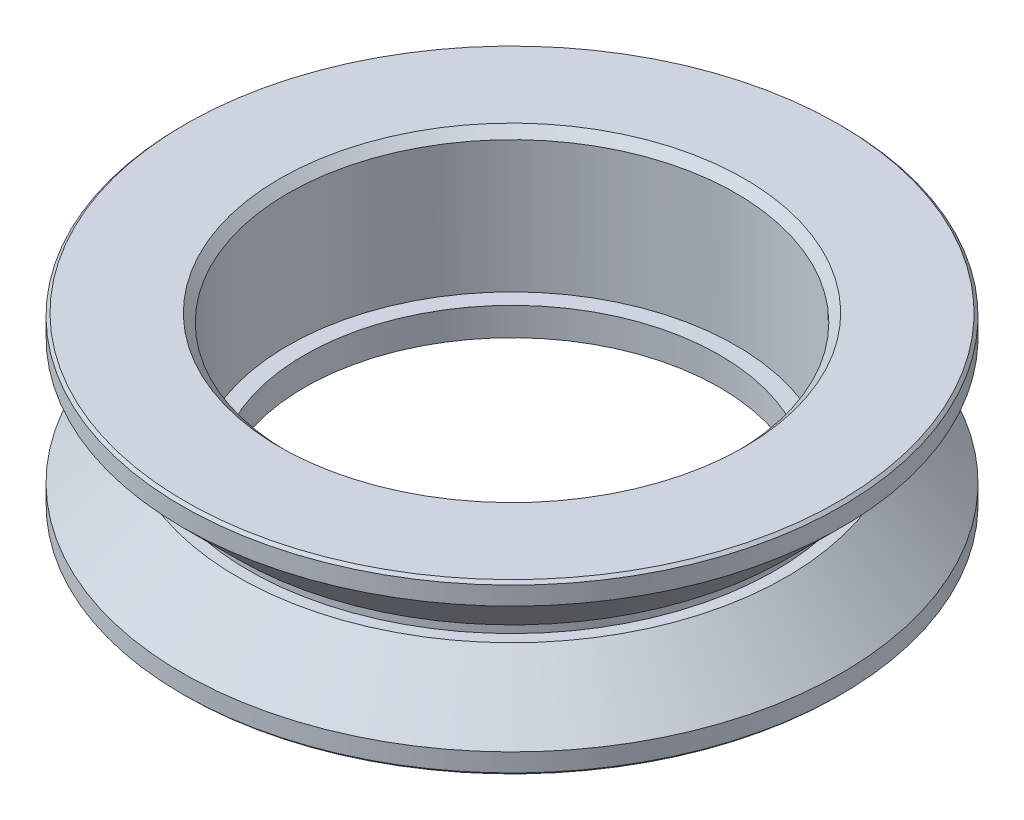
ISO-10303-21;
HEADER;
FILE_DESCRIPTION(('STEP AP214'),'2;1');
FILE_NAME('part.step','',(''),(''),'','','');
FILE_SCHEMA(('AUTOMOTIVE_DESIGN { 1 0 10303 214 1 1 1 1 }'));
ENDSEC;
DATA;
#1=APPLICATION_CONTEXT('core data for automotive mechanical design processes');
#2=APPLICATION_PROTOCOL_DEFINITION('international standard','automotive_design',2000,#1);
#3=PRODUCT_CONTEXT('',#1,'mechanical');
#4=PRODUCT('Part','Part','',(#3));
#5=PRODUCT_RELATED_PRODUCT_CATEGORY('part','',(#4));
#6=PRODUCT_DEFINITION_FORMATION('','',#4);
#7=PRODUCT_DEFINITION_CONTEXT('part definition',#1,'design');
#8=PRODUCT_DEFINITION('design','',#6,#7);
#9=PRODUCT_DEFINITION_SHAPE('','',#8);
#10=(LENGTH_UNIT() NAMED_UNIT(*) SI_UNIT(.MILLI.,.METRE.));
#11=(NAMED_UNIT(*) PLANE_ANGLE_UNIT() SI_UNIT($,.RADIAN.));
#12=(NAMED_UNIT(*) SI_UNIT($,.STERADIAN.) SOLID_ANGLE_UNIT());
#13=UNCERTAINTY_MEASURE_WITH_UNIT(LENGTH_MEASURE(1.E-05),#10,'distance_accuracy_value','');
#14=(GEOMETRIC_REPRESENTATION_CONTEXT(3) GLOBAL_UNCERTAINTY_ASSIGNED_CONTEXT((#13)) GLOBAL_UNIT_ASSIGNED_CONTEXT((#10,
#11,#12)) REPRESENTATION_CONTEXT('',''));
#15=CARTESIAN_POINT('',(0.,0.,0.));
#16=DIRECTION('',(0.,0.,1.));
#17=DIRECTION('',(1.,0.,0.));
#18=AXIS2_PLACEMENT_3D('',#15,#16,#17);
#19=CARTESIAN_POINT('',(0.,2.25000000000015,0.));
#20=DIRECTION('',(0.,1.,0.));
#21=DIRECTION('',(0.,0.,1.));
#22=AXIS2_PLACEMENT_3D('',#19,#20,#21);
#23=CONICAL_SURFACE('',#22,11.7499999999999,0.7853981633973);
#24=CARTESIAN_POINT('',(0.,2.25,0.));
#25=DIRECTION('',(0.,-1.,0.));
#26=DIRECTION('',(0.,0.,-1.));
#27=AXIS2_PLACEMENT_3D('',#24,#25,#26);
#28=CIRCLE('',#27,11.75);
#29=CARTESIAN_POINT('',(0.,2.25,-11.75));
#30=VERTEX_POINT('',#29);
#31=EDGE_CURVE('E30',#30,#30,#28,.F.);
#32=ORIENTED_EDGE('',*,*,#31,.F.);
#33=EDGE_LOOP('',(#32));
#34=FACE_BOUND('',#33,.T.);
#35=CARTESIAN_POINT('',(0.,0.274999999999853,0.));
#36=DIRECTION('',(0.,1.,0.));
#37=DIRECTION('',(0.,0.,1.));
#38=AXIS2_PLACEMENT_3D('',#35,#36,#37);
#39=CIRCLE('',#38,9.77500000000015);
#40=CARTESIAN_POINT('',(0.,0.274999999999853,9.77500000000015));
#41=VERTEX_POINT('',#40);
#42=EDGE_CURVE('E18',#41,#41,#39,.F.);
#43=ORIENTED_EDGE('',*,*,#42,.F.);
#44=EDGE_LOOP('',(#43));
#45=FACE_BOUND('',#44,.T.);
#46=ADVANCED_FACE('F15',(#34,#45),#23,.T.);
#47=CARTESIAN_POINT('',(0.,3.3,0.));
#48=DIRECTION('',(0.,-1.,0.));
#49=DIRECTION('',(0.,0.,-1.));
#50=AXIS2_PLACEMENT_3D('',#47,#48,#49);
#51=CYLINDRICAL_SURFACE('',#50,11.75);
#52=ORIENTED_EDGE('',*,*,#31,.T.);
#53=EDGE_LOOP('',(#52));
#54=FACE_BOUND('',#53,.T.);
#55=CARTESIAN_POINT('',(0.,2.90000000000099,0.));
#56=DIRECTION('',(0.,-1.,0.));
#57=DIRECTION('',(0.,0.,-1.));
#58=AXIS2_PLACEMENT_3D('',#55,#56,#57);
#59=CIRCLE('',#58,11.750000000001);
#60=CARTESIAN_POINT('',(0.,2.90000000000099,-11.750000000001));
#61=VERTEX_POINT('',#60);
#62=EDGE_CURVE('E54',#61,#61,#59,.F.);
#63=ORIENTED_EDGE('',*,*,#62,.F.);
#64=EDGE_LOOP('',(#63));
#65=FACE_BOUND('',#64,.T.);
#66=ADVANCED_FACE('F199',(#54,#65),#51,.T.);
#67=CARTESIAN_POINT('',(0.,0.275,0.));
#68=DIRECTION('',(0.,-1.,0.));
#69=DIRECTION('',(0.,0.,-1.));
#70=AXIS2_PLACEMENT_3D('',#67,#68,#69);
#71=PLANE('',#70);
#72=CARTESIAN_POINT('',(0.,0.275,0.));
#73=DIRECTION('',(0.,-1.,0.));
#74=DIRECTION('',(0.,0.,-1.));
#75=AXIS2_PLACEMENT_3D('',#72,#73,#74);
#76=CIRCLE('',#75,9.375);
#77=CARTESIAN_POINT('',(0.,0.275,-9.375));
#78=VERTEX_POINT('',#77);
#79=EDGE_CURVE('E52',#78,#78,#76,.T.);
#80=ORIENTED_EDGE('',*,*,#79,.F.);
#81=EDGE_LOOP('',(#80));
#82=FACE_BOUND('',#81,.T.);
#83=ORIENTED_EDGE('',*,*,#42,.T.);
#84=EDGE_LOOP('',(#83));
#85=FACE_BOUND('',#84,.T.);
#86=ADVANCED_FACE('F191',(#82,#85),#71,.T.);
#87=CARTESIAN_POINT('',(0.,2.90000000000099,0.));
#88=DIRECTION('',(0.,-1.,0.));
#89=DIRECTION('',(0.,0.,-1.));
#90=AXIS2_PLACEMENT_3D('',#87,#88,#89);
#91=CONICAL_SURFACE('',#90,11.750000000001,0.785398163397297);
#92=ORIENTED_EDGE('',*,*,#62,.T.);
#93=EDGE_LOOP('',(#92));
#94=FACE_BOUND('',#93,.T.);
#95=CARTESIAN_POINT('',(0.,3.00000000000101,0.));
#96=DIRECTION('',(0.,-1.,0.));
#97=DIRECTION('',(0.,0.,-1.));
#98=AXIS2_PLACEMENT_3D('',#95,#96,#97);
#99=CIRCLE('',#98,11.650000000001);
#100=CARTESIAN_POINT('',(0.,3.00000000000101,-11.650000000001));
#101=VERTEX_POINT('',#100);
#102=EDGE_CURVE('E50',#101,#101,#99,.F.);
#103=ORIENTED_EDGE('',*,*,#102,.F.);
#104=EDGE_LOOP('',(#103));
#105=FACE_BOUND('',#104,.T.);
#106=ADVANCED_FACE('F182',(#94,#105),#91,.T.);
#107=CARTESIAN_POINT('',(0.,0.3025,0.));
#108=DIRECTION('',(0.,-1.,0.));
#109=DIRECTION('',(0.,0.,-1.));
#110=AXIS2_PLACEMENT_3D('',#107,#108,#109);
#111=CYLINDRICAL_SURFACE('',#110,9.375);
#112=CARTESIAN_POINT('',(0.,-0.275,0.));
#113=DIRECTION('',(0.,-1.,0.));
#114=DIRECTION('',(0.,0.,-1.));
#115=AXIS2_PLACEMENT_3D('',#112,#113,#114);
#116=CIRCLE('',#115,9.375);
#117=CARTESIAN_POINT('',(0.,-0.275,-9.375));
#118=VERTEX_POINT('',#117);
#119=EDGE_CURVE('E47',#118,#118,#116,.F.);
#120=ORIENTED_EDGE('',*,*,#119,.T.);
#121=EDGE_LOOP('',(#120));
#122=FACE_BOUND('',#121,.T.);
#123=ORIENTED_EDGE('',*,*,#79,.T.);
#124=EDGE_LOOP('',(#123));
#125=FACE_BOUND('',#124,.T.);
#126=ADVANCED_FACE('F173',(#122,#125),#111,.T.);
#127=CARTESIAN_POINT('',(0.,3.,0.));
#128=DIRECTION('',(0.,1.,0.));
#129=DIRECTION('',(0.,0.,1.));
#130=AXIS2_PLACEMENT_3D('',#127,#128,#129);
#131=PLANE('',#130);
#132=CARTESIAN_POINT('',(0.,3.00000000000002,0.));
#133=DIRECTION('',(0.,1.,0.));
#134=DIRECTION('',(-1.,0.,0.));
#135=AXIS2_PLACEMENT_3D('',#132,#133,#134);
#136=CIRCLE('',#135,8.28714999999998);
#137=CARTESIAN_POINT('',(-8.28714999999998,3.00000000000002,0.));
#138=VERTEX_POINT('',#137);
#139=EDGE_CURVE('E44',#138,#138,#136,.F.);
#140=ORIENTED_EDGE('',*,*,#139,.T.);
#141=EDGE_LOOP('',(#140));
#142=FACE_BOUND('',#141,.T.);
#143=ORIENTED_EDGE('',*,*,#102,.T.);
#144=EDGE_LOOP('',(#143));
#145=FACE_BOUND('',#144,.T.);
#146=ADVANCED_FACE('F164',(#142,#145),#131,.T.);
#147=CARTESIAN_POINT('',(0.,-0.275,0.));
#148=DIRECTION('',(0.,-1.,0.));
#149=DIRECTION('',(0.,0.,-1.));
#150=AXIS2_PLACEMENT_3D('',#147,#148,#149);
#151=PLANE('',#150);
#152=ORIENTED_EDGE('',*,*,#119,.F.);
#153=EDGE_LOOP('',(#152));
#154=FACE_BOUND('',#153,.T.);
#155=CARTESIAN_POINT('',(0.,-0.274999999999853,0.));
#156=DIRECTION('',(0.,-1.,0.));
#157=DIRECTION('',(0.,0.,-1.));
#158=AXIS2_PLACEMENT_3D('',#155,#156,#157);
#159=CIRCLE('',#158,9.77500000000015);
#160=CARTESIAN_POINT('',(0.,-0.274999999999853,-9.77500000000015));
#161=VERTEX_POINT('',#160);
#162=EDGE_CURVE('E40',#161,#161,#159,.T.);
#163=ORIENTED_EDGE('',*,*,#162,.F.);
#164=EDGE_LOOP('',(#163));
#165=FACE_BOUND('',#164,.T.);
#166=ADVANCED_FACE('F155',(#154,#165),#151,.F.);
#167=CARTESIAN_POINT('',(0.,3.00000000000002,0.));
#168=DIRECTION('',(0.,1.,0.));
#169=DIRECTION('',(-1.,0.,0.));
#170=AXIS2_PLACEMENT_3D('',#167,#168,#169);
#171=CONICAL_SURFACE('',#170,8.28714999999998,0.785398163397301);
#172=CARTESIAN_POINT('',(0.,2.7,0.));
#173=DIRECTION('',(0.,1.,0.));
#174=DIRECTION('',(0.,0.,1.));
#175=AXIS2_PLACEMENT_3D('',#172,#173,#174);
#176=CIRCLE('',#175,7.98715);
#177=CARTESIAN_POINT('',(0.,2.7,7.98715));
#178=VERTEX_POINT('',#177);
#179=EDGE_CURVE('E43',#178,#178,#176,.F.);
#180=ORIENTED_EDGE('',*,*,#179,.T.);
#181=EDGE_LOOP('',(#180));
#182=FACE_BOUND('',#181,.T.);
#183=ORIENTED_EDGE('',*,*,#139,.F.);
#184=EDGE_LOOP('',(#183));
#185=FACE_BOUND('',#184,.T.);
#186=ADVANCED_FACE('F146',(#182,#185),#171,.F.);
#187=CARTESIAN_POINT('',(0.,-2.25000000000015,0.));
#188=DIRECTION('',(0.,-1.,0.));
#189=DIRECTION('',(0.,0.,-1.));
#190=AXIS2_PLACEMENT_3D('',#187,#188,#189);
#191=CONICAL_SURFACE('',#190,11.7499999999999,0.7853981633973);
#192=CARTESIAN_POINT('',(0.,-2.25,0.));
#193=DIRECTION('',(0.,-1.,0.));
#194=DIRECTION('',(0.,0.,-1.));
#195=AXIS2_PLACEMENT_3D('',#192,#193,#194);
#196=CIRCLE('',#195,11.75);
#197=CARTESIAN_POINT('',(0.,-2.25,-11.75));
#198=VERTEX_POINT('',#197);
#199=EDGE_CURVE('E39',#198,#198,#196,.T.);
#200=ORIENTED_EDGE('',*,*,#199,.F.);
#201=EDGE_LOOP('',(#200));
#202=FACE_BOUND('',#201,.T.);
#203=ORIENTED_EDGE('',*,*,#162,.T.);
#204=EDGE_LOOP('',(#203));
#205=FACE_BOUND('',#204,.T.);
#206=ADVANCED_FACE('F84',(#202,#205),#191,.T.);
#207=CARTESIAN_POINT('',(0.,-3.,0.));
#208=DIRECTION('',(0.,1.,0.));
#209=DIRECTION('',(0.,0.,1.));
#210=AXIS2_PLACEMENT_3D('',#207,#208,#209);
#211=CYLINDRICAL_SURFACE('',#210,7.98715);
#212=CARTESIAN_POINT('',(0.,-2.,0.));
#213=DIRECTION('',(0.,1.,0.));
#214=DIRECTION('',(0.,0.,1.));
#215=AXIS2_PLACEMENT_3D('',#212,#213,#214);
#216=CIRCLE('',#215,7.98715);
#217=CARTESIAN_POINT('',(0.,-2.,7.98715));
#218=VERTEX_POINT('',#217);
#219=EDGE_CURVE('E36',#218,#218,#216,.F.);
#220=ORIENTED_EDGE('',*,*,#219,.T.);
#221=EDGE_LOOP('',(#220));
#222=FACE_BOUND('',#221,.T.);
#223=ORIENTED_EDGE('',*,*,#179,.F.);
#224=EDGE_LOOP('',(#223));
#225=FACE_BOUND('',#224,.T.);
#226=ADVANCED_FACE('F74',(#222,#225),#211,.F.);
#227=CARTESIAN_POINT('',(0.,3.3,0.));
#228=DIRECTION('',(0.,-1.,0.));
#229=DIRECTION('',(0.,0.,-1.));
#230=AXIS2_PLACEMENT_3D('',#227,#228,#229);
#231=CYLINDRICAL_SURFACE('',#230,11.75);
#232=ORIENTED_EDGE('',*,*,#199,.T.);
#233=EDGE_LOOP('',(#232));
#234=FACE_BOUND('',#233,.T.);
#235=CARTESIAN_POINT('',(0.,-2.90000000000199,0.));
#236=DIRECTION('',(0.,1.,0.));
#237=DIRECTION('',(0.,0.,-1.));
#238=AXIS2_PLACEMENT_3D('',#235,#236,#237);
#239=CIRCLE('',#238,11.750000000002);
#240=CARTESIAN_POINT('',(0.,-2.90000000000199,-11.750000000002));
#241=VERTEX_POINT('',#240);
#242=EDGE_CURVE('E35',#241,#241,#239,.F.);
#243=ORIENTED_EDGE('',*,*,#242,.F.);
#244=EDGE_LOOP('',(#243));
#245=FACE_BOUND('',#244,.T.);
#246=ADVANCED_FACE('F71',(#234,#245),#231,.T.);
#247=CARTESIAN_POINT('',(0.,-2.,0.));
#248=DIRECTION('',(0.,-1.,0.));
#249=DIRECTION('',(0.,0.,-1.));
#250=AXIS2_PLACEMENT_3D('',#247,#248,#249);
#251=PLANE('',#250);
#252=CARTESIAN_POINT('',(0.,-2.,0.));
#253=DIRECTION('',(0.,-1.,0.));
#254=DIRECTION('',(0.,0.,-1.));
#255=AXIS2_PLACEMENT_3D('',#252,#253,#254);
#256=CIRCLE('',#255,7.4);
#257=CARTESIAN_POINT('',(0.,-2.,-7.4));
#258=VERTEX_POINT('',#257);
#259=EDGE_CURVE('E27',#258,#258,#256,.T.);
#260=ORIENTED_EDGE('',*,*,#259,.T.);
#261=EDGE_LOOP('',(#260));
#262=FACE_BOUND('',#261,.T.);
#263=ORIENTED_EDGE('',*,*,#219,.F.);
#264=EDGE_LOOP('',(#263));
#265=FACE_BOUND('',#264,.T.);
#266=ADVANCED_FACE('F73',(#262,#265),#251,.F.);
#267=CARTESIAN_POINT('',(0.,-2.90000000000199,0.));
#268=DIRECTION('',(0.,1.,0.));
#269=DIRECTION('',(0.,0.,1.));
#270=AXIS2_PLACEMENT_3D('',#267,#268,#269);
#271=CONICAL_SURFACE('',#270,11.750000000002,0.785398163397299);
#272=CARTESIAN_POINT('',(0.,-3.00000000000201,0.));
#273=DIRECTION('',(0.,1.,0.));
#274=DIRECTION('',(0.,0.,1.));
#275=AXIS2_PLACEMENT_3D('',#272,#273,#274);
#276=CIRCLE('',#275,11.650000000002);
#277=CARTESIAN_POINT('',(0.,-3.00000000000201,11.650000000002));
#278=VERTEX_POINT('',#277);
#279=EDGE_CURVE('E22',#278,#278,#276,.T.);
#280=ORIENTED_EDGE('',*,*,#279,.T.);
#281=EDGE_LOOP('',(#280));
#282=FACE_BOUND('',#281,.T.);
#283=ORIENTED_EDGE('',*,*,#242,.T.);
#284=EDGE_LOOP('',(#283));
#285=FACE_BOUND('',#284,.T.);
#286=ADVANCED_FACE('F69',(#282,#285),#271,.T.);
#287=CARTESIAN_POINT('',(0.,-3.,0.));
#288=DIRECTION('',(0.,-1.,0.));
#289=DIRECTION('',(0.,0.,-1.));
#290=AXIS2_PLACEMENT_3D('',#287,#288,#289);
#291=CYLINDRICAL_SURFACE('',#290,7.4);
#292=ORIENTED_EDGE('',*,*,#259,.F.);
#293=EDGE_LOOP('',(#292));
#294=FACE_BOUND('',#293,.T.);
#295=CARTESIAN_POINT('',(0.,-3.,0.));
#296=DIRECTION('',(0.,-1.,0.));
#297=DIRECTION('',(0.,0.,-1.));
#298=AXIS2_PLACEMENT_3D('',#295,#296,#297);
#299=CIRCLE('',#298,7.4);
#300=CARTESIAN_POINT('',(0.,-3.,-7.4));
#301=VERTEX_POINT('',#300);
#302=EDGE_CURVE('E10',#301,#301,#299,.T.);
#303=ORIENTED_EDGE('',*,*,#302,.T.);
#304=EDGE_LOOP('',(#303));
#305=FACE_BOUND('',#304,.T.);
#306=ADVANCED_FACE('F89',(#294,#305),#291,.F.);
#307=CARTESIAN_POINT('',(0.,-3.,0.));
#308=DIRECTION('',(0.,1.,0.));
#309=DIRECTION('',(0.,0.,1.));
#310=AXIS2_PLACEMENT_3D('',#307,#308,#309);
#311=PLANE('',#310);
#312=ORIENTED_EDGE('',*,*,#302,.F.);
#313=EDGE_LOOP('',(#312));
#314=FACE_BOUND('',#313,.T.);
#315=ORIENTED_EDGE('',*,*,#279,.F.);
#316=EDGE_LOOP('',(#315));
#317=FACE_BOUND('',#316,.T.);
#318=ADVANCED_FACE('F87',(#314,#317),#311,.F.);
#319=CLOSED_SHELL('',(#46,#66,#86,#106,#126,#146,#166,#186,#206,#226,#246,#266,#286,#306,#318));
#320=MANIFOLD_SOLID_BREP('B1',#319);
#321=ADVANCED_BREP_SHAPE_REPRESENTATION('',(#18,#320),#14);
#322=SHAPE_DEFINITION_REPRESENTATION(#9,#321);
ENDSEC;
END-ISO-10303-21;
